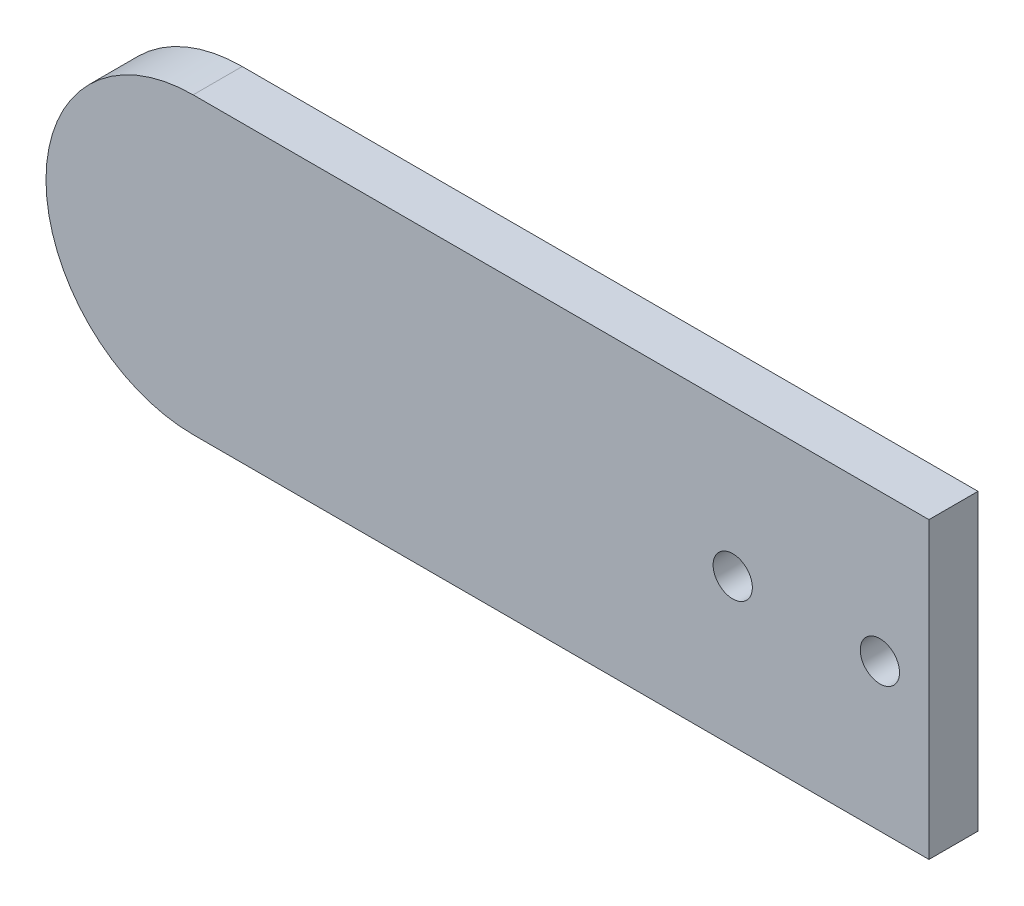
ISO-10303-21;
HEADER;
FILE_DESCRIPTION(('STEP AP214'),'2;1');
FILE_NAME('part.step','',(''),(''),'','','');
FILE_SCHEMA(('AUTOMOTIVE_DESIGN { 1 0 10303 214 1 1 1 1 }'));
ENDSEC;
DATA;
#1=APPLICATION_CONTEXT('core data for automotive mechanical design processes');
#2=APPLICATION_PROTOCOL_DEFINITION('international standard','automotive_design',2000,#1);
#3=PRODUCT_CONTEXT('',#1,'mechanical');
#4=PRODUCT('Part','Part','',(#3));
#5=PRODUCT_RELATED_PRODUCT_CATEGORY('part','',(#4));
#6=PRODUCT_DEFINITION_FORMATION('','',#4);
#7=PRODUCT_DEFINITION_CONTEXT('part definition',#1,'design');
#8=PRODUCT_DEFINITION('design','',#6,#7);
#9=PRODUCT_DEFINITION_SHAPE('','',#8);
#10=(LENGTH_UNIT() NAMED_UNIT(*) SI_UNIT(.MILLI.,.METRE.));
#11=(NAMED_UNIT(*) PLANE_ANGLE_UNIT() SI_UNIT($,.RADIAN.));
#12=(NAMED_UNIT(*) SI_UNIT($,.STERADIAN.) SOLID_ANGLE_UNIT());
#13=UNCERTAINTY_MEASURE_WITH_UNIT(LENGTH_MEASURE(1.E-05),#10,'distance_accuracy_value','');
#14=(GEOMETRIC_REPRESENTATION_CONTEXT(3) GLOBAL_UNCERTAINTY_ASSIGNED_CONTEXT((#13)) GLOBAL_UNIT_ASSIGNED_CONTEXT((#10,
#11,#12)) REPRESENTATION_CONTEXT('',''));
#15=CARTESIAN_POINT('',(0.,0.,0.));
#16=DIRECTION('',(0.,0.,1.));
#17=DIRECTION('',(1.,0.,0.));
#18=AXIS2_PLACEMENT_3D('',#15,#16,#17);
#19=CARTESIAN_POINT('',(45.,15.,5.));
#20=DIRECTION('',(-1.,0.,0.));
#21=DIRECTION('',(0.,0.,1.));
#22=AXIS2_PLACEMENT_3D('',#19,#20,#21);
#23=PLANE('',#22);
#24=DIRECTION('',(0.,1.,0.));
#25=VECTOR('',#24,1.);
#26=CARTESIAN_POINT('',(45.,15.,0.));
#27=LINE('',#26,#25);
#28=CARTESIAN_POINT('',(45.,-15.,0.));
#29=VERTEX_POINT('',#28);
#30=CARTESIAN_POINT('',(45.,15.,0.));
#31=VERTEX_POINT('',#30);
#32=EDGE_CURVE('E102',#29,#31,#27,.T.);
#33=ORIENTED_EDGE('',*,*,#32,.T.);
#34=DIRECTION('',(0.,0.,-1.));
#35=VECTOR('',#34,1.);
#36=CARTESIAN_POINT('',(45.,15.,5.));
#37=LINE('',#36,#35);
#38=CARTESIAN_POINT('',(45.,15.,5.));
#39=VERTEX_POINT('',#38);
#40=EDGE_CURVE('E93',#39,#31,#37,.T.);
#41=ORIENTED_EDGE('',*,*,#40,.F.);
#42=DIRECTION('',(0.,1.,0.));
#43=VECTOR('',#42,1.);
#44=CARTESIAN_POINT('',(45.,15.,5.));
#45=LINE('',#44,#43);
#46=CARTESIAN_POINT('',(45.,-15.,5.));
#47=VERTEX_POINT('',#46);
#48=EDGE_CURVE('E87',#47,#39,#45,.T.);
#49=ORIENTED_EDGE('',*,*,#48,.F.);
#50=DIRECTION('',(0.,0.,-1.));
#51=VECTOR('',#50,1.);
#52=CARTESIAN_POINT('',(45.,-15.,5.));
#53=LINE('',#52,#51);
#54=EDGE_CURVE('E98',#47,#29,#53,.T.);
#55=ORIENTED_EDGE('',*,*,#54,.T.);
#56=EDGE_LOOP('',(#33,#41,#49,#55));
#57=FACE_BOUND('',#56,.T.);
#58=ADVANCED_FACE('F34',(#57),#23,.F.);
#59=CARTESIAN_POINT('',(-30.,15.,5.));
#60=DIRECTION('',(0.,-1.,0.));
#61=DIRECTION('',(1.,0.,0.));
#62=AXIS2_PLACEMENT_3D('',#59,#60,#61);
#63=PLANE('',#62);
#64=DIRECTION('',(-1.,0.,0.));
#65=VECTOR('',#64,1.);
#66=CARTESIAN_POINT('',(-30.,15.,0.));
#67=LINE('',#66,#65);
#68=CARTESIAN_POINT('',(-30.,15.,0.));
#69=VERTEX_POINT('',#68);
#70=EDGE_CURVE('E92',#31,#69,#67,.T.);
#71=ORIENTED_EDGE('',*,*,#70,.T.);
#72=DIRECTION('',(0.,0.,-1.));
#73=VECTOR('',#72,1.);
#74=CARTESIAN_POINT('',(-30.,15.,5.));
#75=LINE('',#74,#73);
#76=CARTESIAN_POINT('',(-30.,15.,5.));
#77=VERTEX_POINT('',#76);
#78=EDGE_CURVE('E90',#77,#69,#75,.T.);
#79=ORIENTED_EDGE('',*,*,#78,.F.);
#80=DIRECTION('',(-1.,0.,0.));
#81=VECTOR('',#80,1.);
#82=CARTESIAN_POINT('',(-30.,15.,5.));
#83=LINE('',#82,#81);
#84=EDGE_CURVE('E82',#39,#77,#83,.T.);
#85=ORIENTED_EDGE('',*,*,#84,.F.);
#86=ORIENTED_EDGE('',*,*,#40,.T.);
#87=EDGE_LOOP('',(#71,#79,#85,#86));
#88=FACE_BOUND('',#87,.T.);
#89=ADVANCED_FACE('F91',(#88),#63,.F.);
#90=CARTESIAN_POINT('',(-30.,0.,5.));
#91=DIRECTION('',(0.,0.,-1.));
#92=DIRECTION('',(-1.,0.,0.));
#93=AXIS2_PLACEMENT_3D('',#90,#91,#92);
#94=CYLINDRICAL_SURFACE('',#93,15.);
#95=CARTESIAN_POINT('',(-30.,0.,0.));
#96=DIRECTION('',(0.,0.,1.));
#97=DIRECTION('',(1.,0.,0.));
#98=AXIS2_PLACEMENT_3D('',#95,#96,#97);
#99=CIRCLE('',#98,15.);
#100=CARTESIAN_POINT('',(-30.,-15.,0.));
#101=VERTEX_POINT('',#100);
#102=EDGE_CURVE('E68',#69,#101,#99,.T.);
#103=ORIENTED_EDGE('',*,*,#102,.T.);
#104=DIRECTION('',(0.,0.,-1.));
#105=VECTOR('',#104,1.);
#106=CARTESIAN_POINT('',(-30.,-15.,5.));
#107=LINE('',#106,#105);
#108=CARTESIAN_POINT('',(-30.,-15.,5.));
#109=VERTEX_POINT('',#108);
#110=EDGE_CURVE('E94',#109,#101,#107,.T.);
#111=ORIENTED_EDGE('',*,*,#110,.F.);
#112=CARTESIAN_POINT('',(-30.,0.,5.));
#113=DIRECTION('',(0.,0.,1.));
#114=DIRECTION('',(1.,0.,0.));
#115=AXIS2_PLACEMENT_3D('',#112,#113,#114);
#116=CIRCLE('',#115,15.);
#117=EDGE_CURVE('E85',#77,#109,#116,.T.);
#118=ORIENTED_EDGE('',*,*,#117,.F.);
#119=ORIENTED_EDGE('',*,*,#78,.T.);
#120=EDGE_LOOP('',(#103,#111,#118,#119));
#121=FACE_BOUND('',#120,.T.);
#122=ADVANCED_FACE('F96',(#121),#94,.T.);
#123=CARTESIAN_POINT('',(-30.,-15.,5.));
#124=DIRECTION('',(0.,1.,0.));
#125=DIRECTION('',(-1.,0.,0.));
#126=AXIS2_PLACEMENT_3D('',#123,#124,#125);
#127=PLANE('',#126);
#128=DIRECTION('',(1.,0.,0.));
#129=VECTOR('',#128,1.);
#130=CARTESIAN_POINT('',(-30.,-15.,0.));
#131=LINE('',#130,#129);
#132=EDGE_CURVE('E74',#101,#29,#131,.T.);
#133=ORIENTED_EDGE('',*,*,#132,.T.);
#134=ORIENTED_EDGE('',*,*,#54,.F.);
#135=DIRECTION('',(1.,0.,0.));
#136=VECTOR('',#135,1.);
#137=CARTESIAN_POINT('',(-30.,-15.,5.));
#138=LINE('',#137,#136);
#139=EDGE_CURVE('E51',#109,#47,#138,.T.);
#140=ORIENTED_EDGE('',*,*,#139,.F.);
#141=ORIENTED_EDGE('',*,*,#110,.T.);
#142=EDGE_LOOP('',(#133,#134,#140,#141));
#143=FACE_BOUND('',#142,.T.);
#144=ADVANCED_FACE('F130',(#143),#127,.F.);
#145=CARTESIAN_POINT('',(-30.,0.,5.));
#146=DIRECTION('',(0.,0.,1.));
#147=DIRECTION('',(1.,0.,0.));
#148=AXIS2_PLACEMENT_3D('',#145,#146,#147);
#149=PLANE('',#148);
#150=CARTESIAN_POINT('',(40.,0.,5.));
#151=DIRECTION('',(0.,0.,-1.));
#152=DIRECTION('',(-1.,0.,0.));
#153=AXIS2_PLACEMENT_3D('',#150,#151,#152);
#154=CIRCLE('',#153,2.);
#155=CARTESIAN_POINT('',(38.,0.,5.));
#156=VERTEX_POINT('',#155);
#157=EDGE_CURVE('E105',#156,#156,#154,.T.);
#158=ORIENTED_EDGE('',*,*,#157,.T.);
#159=EDGE_LOOP('',(#158));
#160=FACE_BOUND('',#159,.T.);
#161=CARTESIAN_POINT('',(25.,0.,5.));
#162=DIRECTION('',(0.,0.,-1.));
#163=DIRECTION('',(-1.,0.,0.));
#164=AXIS2_PLACEMENT_3D('',#161,#162,#163);
#165=CIRCLE('',#164,2.);
#166=CARTESIAN_POINT('',(23.,0.,5.));
#167=VERTEX_POINT('',#166);
#168=EDGE_CURVE('E239',#167,#167,#165,.T.);
#169=ORIENTED_EDGE('',*,*,#168,.T.);
#170=EDGE_LOOP('',(#169));
#171=FACE_BOUND('',#170,.T.);
#172=ORIENTED_EDGE('',*,*,#48,.T.);
#173=ORIENTED_EDGE('',*,*,#84,.T.);
#174=ORIENTED_EDGE('',*,*,#117,.T.);
#175=ORIENTED_EDGE('',*,*,#139,.T.);
#176=EDGE_LOOP('',(#172,#173,#174,#175));
#177=FACE_BOUND('',#176,.T.);
#178=ADVANCED_FACE('F83',(#160,#171,#177),#149,.T.);
#179=CARTESIAN_POINT('',(-30.,0.,0.));
#180=DIRECTION('',(0.,0.,1.));
#181=DIRECTION('',(1.,0.,0.));
#182=AXIS2_PLACEMENT_3D('',#179,#180,#181);
#183=PLANE('',#182);
#184=CARTESIAN_POINT('',(-20.,0.,0.));
#185=DIRECTION('',(0.,0.,1.));
#186=DIRECTION('',(1.,0.,0.));
#187=AXIS2_PLACEMENT_3D('',#184,#185,#186);
#188=CIRCLE('',#187,7.5);
#189=CARTESIAN_POINT('',(-12.5,0.,0.));
#190=VERTEX_POINT('',#189);
#191=EDGE_CURVE('E37',#190,#190,#188,.F.);
#192=ORIENTED_EDGE('',*,*,#191,.F.);
#193=EDGE_LOOP('',(#192));
#194=FACE_BOUND('',#193,.T.);
#195=CARTESIAN_POINT('',(40.,0.,0.));
#196=DIRECTION('',(0.,0.,-1.));
#197=DIRECTION('',(-1.,0.,0.));
#198=AXIS2_PLACEMENT_3D('',#195,#196,#197);
#199=CIRCLE('',#198,2.);
#200=CARTESIAN_POINT('',(38.,0.,0.));
#201=VERTEX_POINT('',#200);
#202=EDGE_CURVE('E123',#201,#201,#199,.T.);
#203=ORIENTED_EDGE('',*,*,#202,.F.);
#204=EDGE_LOOP('',(#203));
#205=FACE_BOUND('',#204,.T.);
#206=CARTESIAN_POINT('',(25.,0.,0.));
#207=DIRECTION('',(0.,0.,-1.));
#208=DIRECTION('',(-1.,0.,0.));
#209=AXIS2_PLACEMENT_3D('',#206,#207,#208);
#210=CIRCLE('',#209,2.);
#211=CARTESIAN_POINT('',(23.,0.,0.));
#212=VERTEX_POINT('',#211);
#213=EDGE_CURVE('E127',#212,#212,#210,.T.);
#214=ORIENTED_EDGE('',*,*,#213,.F.);
#215=EDGE_LOOP('',(#214));
#216=FACE_BOUND('',#215,.T.);
#217=ORIENTED_EDGE('',*,*,#32,.F.);
#218=ORIENTED_EDGE('',*,*,#132,.F.);
#219=ORIENTED_EDGE('',*,*,#102,.F.);
#220=ORIENTED_EDGE('',*,*,#70,.F.);
#221=EDGE_LOOP('',(#217,#218,#219,#220));
#222=FACE_BOUND('',#221,.T.);
#223=ADVANCED_FACE('F115',(#194,#205,#216,#222),#183,.F.);
#224=CARTESIAN_POINT('',(25.,0.,5.));
#225=DIRECTION('',(0.,0.,-1.));
#226=DIRECTION('',(-1.,0.,0.));
#227=AXIS2_PLACEMENT_3D('',#224,#225,#226);
#228=CYLINDRICAL_SURFACE('',#227,2.);
#229=ORIENTED_EDGE('',*,*,#168,.F.);
#230=EDGE_LOOP('',(#229));
#231=FACE_BOUND('',#230,.T.);
#232=ORIENTED_EDGE('',*,*,#213,.T.);
#233=EDGE_LOOP('',(#232));
#234=FACE_BOUND('',#233,.T.);
#235=ADVANCED_FACE('F118',(#231,#234),#228,.F.);
#236=CARTESIAN_POINT('',(40.,0.,5.));
#237=DIRECTION('',(0.,0.,-1.));
#238=DIRECTION('',(-1.,0.,0.));
#239=AXIS2_PLACEMENT_3D('',#236,#237,#238);
#240=CYLINDRICAL_SURFACE('',#239,2.);
#241=ORIENTED_EDGE('',*,*,#157,.F.);
#242=EDGE_LOOP('',(#241));
#243=FACE_BOUND('',#242,.T.);
#244=ORIENTED_EDGE('',*,*,#202,.T.);
#245=EDGE_LOOP('',(#244));
#246=FACE_BOUND('',#245,.T.);
#247=ADVANCED_FACE('F170',(#243,#246),#240,.F.);
#248=CARTESIAN_POINT('',(-20.,0.,-1.));
#249=DIRECTION('',(0.,0.,1.));
#250=DIRECTION('',(1.,0.,0.));
#251=AXIS2_PLACEMENT_3D('',#248,#249,#250);
#252=CYLINDRICAL_SURFACE('',#251,7.5);
#253=CARTESIAN_POINT('',(-20.,0.,-1.));
#254=DIRECTION('',(0.,0.,-1.));
#255=DIRECTION('',(-1.,0.,0.));
#256=AXIS2_PLACEMENT_3D('',#253,#254,#255);
#257=CIRCLE('',#256,7.5);
#258=CARTESIAN_POINT('',(-27.5,0.,-1.));
#259=VERTEX_POINT('',#258);
#260=EDGE_CURVE('E231',#259,#259,#257,.T.);
#261=ORIENTED_EDGE('',*,*,#260,.F.);
#262=EDGE_LOOP('',(#261));
#263=FACE_BOUND('',#262,.T.);
#264=ORIENTED_EDGE('',*,*,#191,.T.);
#265=EDGE_LOOP('',(#264));
#266=FACE_BOUND('',#265,.T.);
#267=ADVANCED_FACE('F113',(#263,#266),#252,.T.);
#268=CARTESIAN_POINT('',(-20.,0.,-1.));
#269=DIRECTION('',(0.,0.,-1.));
#270=DIRECTION('',(-1.,0.,0.));
#271=AXIS2_PLACEMENT_3D('',#268,#269,#270);
#272=PLANE('',#271);
#273=CARTESIAN_POINT('',(-20.,0.,-1.));
#274=DIRECTION('',(0.,0.,-1.));
#275=DIRECTION('',(-1.,0.,0.));
#276=AXIS2_PLACEMENT_3D('',#273,#274,#275);
#277=CIRCLE('',#276,5.);
#278=CARTESIAN_POINT('',(-25.,0.,-1.));
#279=VERTEX_POINT('',#278);
#280=EDGE_CURVE('E11',#279,#279,#277,.T.);
#281=ORIENTED_EDGE('',*,*,#280,.F.);
#282=EDGE_LOOP('',(#281));
#283=FACE_BOUND('',#282,.T.);
#284=ORIENTED_EDGE('',*,*,#260,.T.);
#285=EDGE_LOOP('',(#284));
#286=FACE_BOUND('',#285,.T.);
#287=ADVANCED_FACE('F194',(#283,#286),#272,.T.);
#288=CARTESIAN_POINT('',(-20.,0.,-6.));
#289=DIRECTION('',(0.,0.,1.));
#290=DIRECTION('',(1.,0.,0.));
#291=AXIS2_PLACEMENT_3D('',#288,#289,#290);
#292=CYLINDRICAL_SURFACE('',#291,5.);
#293=CARTESIAN_POINT('',(-20.,0.,-6.));
#294=DIRECTION('',(0.,0.,-1.));
#295=DIRECTION('',(-1.,0.,0.));
#296=AXIS2_PLACEMENT_3D('',#293,#294,#295);
#297=CIRCLE('',#296,5.);
#298=CARTESIAN_POINT('',(-25.,0.,-6.));
#299=VERTEX_POINT('',#298);
#300=EDGE_CURVE('E230',#299,#299,#297,.T.);
#301=ORIENTED_EDGE('',*,*,#300,.F.);
#302=EDGE_LOOP('',(#301));
#303=FACE_BOUND('',#302,.T.);
#304=ORIENTED_EDGE('',*,*,#280,.T.);
#305=EDGE_LOOP('',(#304));
#306=FACE_BOUND('',#305,.T.);
#307=ADVANCED_FACE('F204',(#303,#306),#292,.T.);
#308=CARTESIAN_POINT('',(-20.,0.,-6.));
#309=DIRECTION('',(0.,0.,-1.));
#310=DIRECTION('',(-1.,0.,0.));
#311=AXIS2_PLACEMENT_3D('',#308,#309,#310);
#312=PLANE('',#311);
#313=ORIENTED_EDGE('',*,*,#300,.T.);
#314=EDGE_LOOP('',(#313));
#315=FACE_BOUND('',#314,.T.);
#316=ADVANCED_FACE('F214',(#315),#312,.T.);
#317=CLOSED_SHELL('',(#58,#89,#122,#144,#178,#223,#235,#247,#267,#287,#307,#316));
#318=MANIFOLD_SOLID_BREP('B2',#317);
#319=ADVANCED_BREP_SHAPE_REPRESENTATION('',(#18,#318),#14);
#320=SHAPE_DEFINITION_REPRESENTATION(#9,#319);
ENDSEC;
END-ISO-10303-21;
